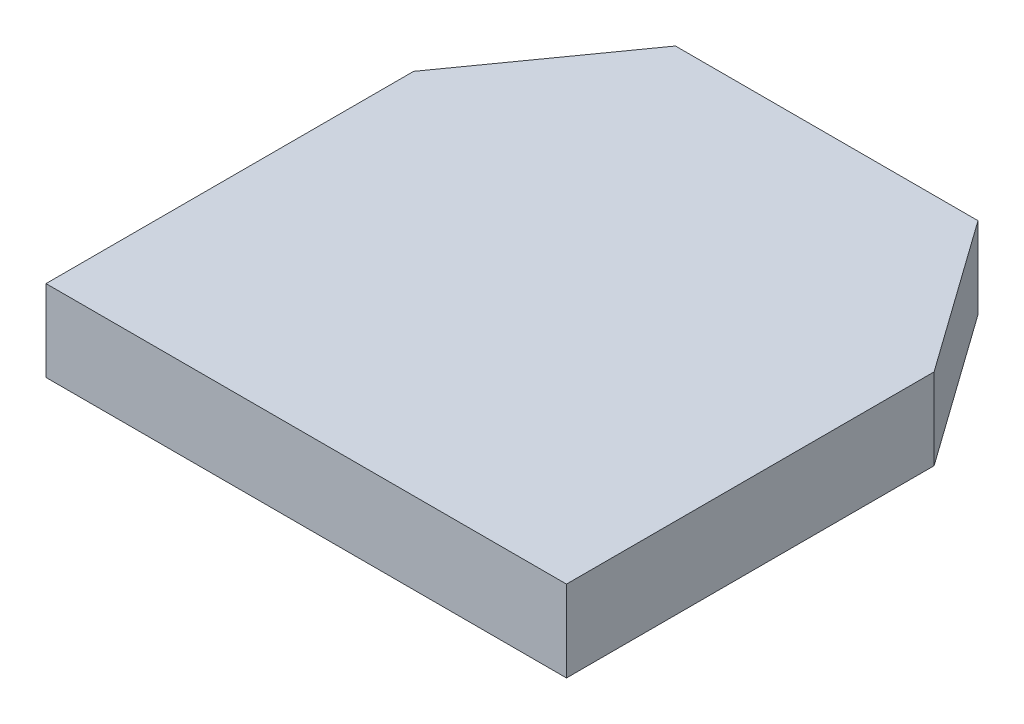
ISO-10303-21;
HEADER;
FILE_DESCRIPTION(('STEP AP214'),'2;1');
FILE_NAME('part.step','',(''),(''),'','','');
FILE_SCHEMA(('AUTOMOTIVE_DESIGN { 1 0 10303 214 1 1 1 1 }'));
ENDSEC;
DATA;
#1=APPLICATION_CONTEXT('core data for automotive mechanical design processes');
#2=APPLICATION_PROTOCOL_DEFINITION('international standard','automotive_design',2000,#1);
#3=PRODUCT_CONTEXT('',#1,'mechanical');
#4=PRODUCT('Part','Part','',(#3));
#5=PRODUCT_RELATED_PRODUCT_CATEGORY('part','',(#4));
#6=PRODUCT_DEFINITION_FORMATION('','',#4);
#7=PRODUCT_DEFINITION_CONTEXT('part definition',#1,'design');
#8=PRODUCT_DEFINITION('design','',#6,#7);
#9=PRODUCT_DEFINITION_SHAPE('','',#8);
#10=(LENGTH_UNIT() NAMED_UNIT(*) SI_UNIT(.MILLI.,.METRE.));
#11=(NAMED_UNIT(*) PLANE_ANGLE_UNIT() SI_UNIT($,.RADIAN.));
#12=(NAMED_UNIT(*) SI_UNIT($,.STERADIAN.) SOLID_ANGLE_UNIT());
#13=UNCERTAINTY_MEASURE_WITH_UNIT(LENGTH_MEASURE(1.E-05),#10,'distance_accuracy_value','');
#14=(GEOMETRIC_REPRESENTATION_CONTEXT(3) GLOBAL_UNCERTAINTY_ASSIGNED_CONTEXT((#13)) GLOBAL_UNIT_ASSIGNED_CONTEXT((#10,
#11,#12)) REPRESENTATION_CONTEXT('',''));
#15=CARTESIAN_POINT('',(0.,0.,0.));
#16=DIRECTION('',(0.,0.,1.));
#17=DIRECTION('',(1.,0.,0.));
#18=AXIS2_PLACEMENT_3D('',#15,#16,#17);
#19=CARTESIAN_POINT('',(0.,6.35,0.));
#20=DIRECTION('',(1.,0.,0.));
#21=DIRECTION('',(0.,0.,-1.));
#22=AXIS2_PLACEMENT_3D('',#19,#20,#21);
#23=PLANE('',#22);
#24=DIRECTION('',(0.,0.,1.));
#25=VECTOR('',#24,1.);
#26=CARTESIAN_POINT('',(0.,0.,0.));
#27=LINE('',#26,#25);
#28=CARTESIAN_POINT('',(0.,0.,-28.702));
#29=VERTEX_POINT('',#28);
#30=CARTESIAN_POINT('',(0.,0.,0.));
#31=VERTEX_POINT('',#30);
#32=EDGE_CURVE('E116',#29,#31,#27,.T.);
#33=ORIENTED_EDGE('',*,*,#32,.T.);
#34=DIRECTION('',(0.,-1.,0.));
#35=VECTOR('',#34,1.);
#36=CARTESIAN_POINT('',(0.,6.35,0.));
#37=LINE('',#36,#35);
#38=CARTESIAN_POINT('',(0.,6.35,0.));
#39=VERTEX_POINT('',#38);
#40=EDGE_CURVE('E11',#39,#31,#37,.T.);
#41=ORIENTED_EDGE('',*,*,#40,.F.);
#42=DIRECTION('',(0.,0.,1.));
#43=VECTOR('',#42,1.);
#44=CARTESIAN_POINT('',(0.,6.35,0.));
#45=LINE('',#44,#43);
#46=CARTESIAN_POINT('',(0.,6.35,-28.702));
#47=VERTEX_POINT('',#46);
#48=EDGE_CURVE('E126',#47,#39,#45,.T.);
#49=ORIENTED_EDGE('',*,*,#48,.F.);
#50=DIRECTION('',(0.,-1.,0.));
#51=VECTOR('',#50,1.);
#52=CARTESIAN_POINT('',(0.,6.35,-28.702));
#53=LINE('',#52,#51);
#54=EDGE_CURVE('E112',#47,#29,#53,.T.);
#55=ORIENTED_EDGE('',*,*,#54,.T.);
#56=EDGE_LOOP('',(#33,#41,#49,#55));
#57=FACE_BOUND('',#56,.T.);
#58=ADVANCED_FACE('F32',(#57),#23,.F.);
#59=CARTESIAN_POINT('',(0.,6.35,0.));
#60=DIRECTION('',(0.,0.,-1.));
#61=DIRECTION('',(-1.,0.,0.));
#62=AXIS2_PLACEMENT_3D('',#59,#60,#61);
#63=PLANE('',#62);
#64=DIRECTION('',(1.,0.,0.));
#65=VECTOR('',#64,1.);
#66=CARTESIAN_POINT('',(0.,0.,0.));
#67=LINE('',#66,#65);
#68=CARTESIAN_POINT('',(40.64,0.,0.));
#69=VERTEX_POINT('',#68);
#70=EDGE_CURVE('E119',#31,#69,#67,.T.);
#71=ORIENTED_EDGE('',*,*,#70,.T.);
#72=DIRECTION('',(0.,-1.,0.));
#73=VECTOR('',#72,1.);
#74=CARTESIAN_POINT('',(40.64,6.35,0.));
#75=LINE('',#74,#73);
#76=CARTESIAN_POINT('',(40.64,6.35,0.));
#77=VERTEX_POINT('',#76);
#78=EDGE_CURVE('E40',#77,#69,#75,.T.);
#79=ORIENTED_EDGE('',*,*,#78,.F.);
#80=DIRECTION('',(1.,0.,0.));
#81=VECTOR('',#80,1.);
#82=CARTESIAN_POINT('',(0.,6.35,0.));
#83=LINE('',#82,#81);
#84=EDGE_CURVE('E85',#39,#77,#83,.T.);
#85=ORIENTED_EDGE('',*,*,#84,.F.);
#86=ORIENTED_EDGE('',*,*,#40,.T.);
#87=EDGE_LOOP('',(#71,#79,#85,#86));
#88=FACE_BOUND('',#87,.T.);
#89=ADVANCED_FACE('F150',(#88),#63,.F.);
#90=CARTESIAN_POINT('',(40.64,6.35,0.));
#91=DIRECTION('',(-1.,0.,0.));
#92=DIRECTION('',(0.,0.,1.));
#93=AXIS2_PLACEMENT_3D('',#90,#91,#92);
#94=PLANE('',#93);
#95=DIRECTION('',(0.,0.,-1.));
#96=VECTOR('',#95,1.);
#97=CARTESIAN_POINT('',(40.64,0.,0.));
#98=LINE('',#97,#96);
#99=CARTESIAN_POINT('',(40.64,0.,-28.702));
#100=VERTEX_POINT('',#99);
#101=EDGE_CURVE('E121',#69,#100,#98,.T.);
#102=ORIENTED_EDGE('',*,*,#101,.T.);
#103=DIRECTION('',(0.,-1.,0.));
#104=VECTOR('',#103,1.);
#105=CARTESIAN_POINT('',(40.64,6.35,-28.702));
#106=LINE('',#105,#104);
#107=CARTESIAN_POINT('',(40.64,6.35,-28.702));
#108=VERTEX_POINT('',#107);
#109=EDGE_CURVE('E107',#108,#100,#106,.T.);
#110=ORIENTED_EDGE('',*,*,#109,.F.);
#111=DIRECTION('',(0.,0.,-1.));
#112=VECTOR('',#111,1.);
#113=CARTESIAN_POINT('',(40.64,6.35,0.));
#114=LINE('',#113,#112);
#115=EDGE_CURVE('E98',#77,#108,#114,.T.);
#116=ORIENTED_EDGE('',*,*,#115,.F.);
#117=ORIENTED_EDGE('',*,*,#78,.T.);
#118=EDGE_LOOP('',(#102,#110,#116,#117));
#119=FACE_BOUND('',#118,.T.);
#120=ADVANCED_FACE('F132',(#119),#94,.F.);
#121=CARTESIAN_POINT('',(40.64,6.35,-28.702));
#122=DIRECTION('',(-0.814318393829515,0.,0.580418429644442));
#123=DIRECTION('',(0.580418429644442,0.,0.814318393829515));
#124=AXIS2_PLACEMENT_3D('',#121,#122,#123);
#125=PLANE('',#124);
#126=DIRECTION('',(-0.580418429644442,0.,-0.814318393829515));
#127=VECTOR('',#126,1.);
#128=CARTESIAN_POINT('',(40.64,0.,-28.702));
#129=LINE('',#128,#127);
#130=CARTESIAN_POINT('',(32.131,0.,-40.64));
#131=VERTEX_POINT('',#130);
#132=EDGE_CURVE('E106',#100,#131,#129,.T.);
#133=ORIENTED_EDGE('',*,*,#132,.T.);
#134=DIRECTION('',(0.,-1.,0.));
#135=VECTOR('',#134,1.);
#136=CARTESIAN_POINT('',(32.131,6.35,-40.64));
#137=LINE('',#136,#135);
#138=CARTESIAN_POINT('',(32.131,6.35,-40.64));
#139=VERTEX_POINT('',#138);
#140=EDGE_CURVE('E103',#139,#131,#137,.T.);
#141=ORIENTED_EDGE('',*,*,#140,.F.);
#142=DIRECTION('',(-0.580418429644442,0.,-0.814318393829515));
#143=VECTOR('',#142,1.);
#144=CARTESIAN_POINT('',(40.64,6.35,-28.702));
#145=LINE('',#144,#143);
#146=EDGE_CURVE('E92',#108,#139,#145,.T.);
#147=ORIENTED_EDGE('',*,*,#146,.F.);
#148=ORIENTED_EDGE('',*,*,#109,.T.);
#149=EDGE_LOOP('',(#133,#141,#147,#148));
#150=FACE_BOUND('',#149,.T.);
#151=ADVANCED_FACE('F104',(#150),#125,.F.);
#152=CARTESIAN_POINT('',(8.509,6.35,-40.64));
#153=DIRECTION('',(0.,0.,1.));
#154=DIRECTION('',(1.,0.,0.));
#155=AXIS2_PLACEMENT_3D('',#152,#153,#154);
#156=PLANE('',#155);
#157=DIRECTION('',(-1.,0.,0.));
#158=VECTOR('',#157,1.);
#159=CARTESIAN_POINT('',(8.509,0.,-40.64));
#160=LINE('',#159,#158);
#161=CARTESIAN_POINT('',(8.509,0.,-40.64));
#162=VERTEX_POINT('',#161);
#163=EDGE_CURVE('E71',#131,#162,#160,.T.);
#164=ORIENTED_EDGE('',*,*,#163,.T.);
#165=DIRECTION('',(0.,-1.,0.));
#166=VECTOR('',#165,1.);
#167=CARTESIAN_POINT('',(8.509,6.35,-40.64));
#168=LINE('',#167,#166);
#169=CARTESIAN_POINT('',(8.509,6.35,-40.64));
#170=VERTEX_POINT('',#169);
#171=EDGE_CURVE('E108',#170,#162,#168,.T.);
#172=ORIENTED_EDGE('',*,*,#171,.F.);
#173=DIRECTION('',(-1.,0.,0.));
#174=VECTOR('',#173,1.);
#175=CARTESIAN_POINT('',(8.509,6.35,-40.64));
#176=LINE('',#175,#174);
#177=EDGE_CURVE('E96',#139,#170,#176,.T.);
#178=ORIENTED_EDGE('',*,*,#177,.F.);
#179=ORIENTED_EDGE('',*,*,#140,.T.);
#180=EDGE_LOOP('',(#164,#172,#178,#179));
#181=FACE_BOUND('',#180,.T.);
#182=ADVANCED_FACE('F110',(#181),#156,.F.);
#183=CARTESIAN_POINT('',(0.,6.35,-28.702));
#184=DIRECTION('',(0.814318393829515,0.,0.580418429644441));
#185=DIRECTION('',(0.580418429644442,0.,-0.814318393829515));
#186=AXIS2_PLACEMENT_3D('',#183,#184,#185);
#187=PLANE('',#186);
#188=DIRECTION('',(-0.580418429644442,0.,0.814318393829515));
#189=VECTOR('',#188,1.);
#190=CARTESIAN_POINT('',(0.,0.,-28.702));
#191=LINE('',#190,#189);
#192=EDGE_CURVE('E77',#162,#29,#191,.T.);
#193=ORIENTED_EDGE('',*,*,#192,.T.);
#194=ORIENTED_EDGE('',*,*,#54,.F.);
#195=DIRECTION('',(-0.580418429644442,0.,0.814318393829515));
#196=VECTOR('',#195,1.);
#197=CARTESIAN_POINT('',(0.,6.35,-28.702));
#198=LINE('',#197,#196);
#199=EDGE_CURVE('E48',#170,#47,#198,.T.);
#200=ORIENTED_EDGE('',*,*,#199,.F.);
#201=ORIENTED_EDGE('',*,*,#171,.T.);
#202=EDGE_LOOP('',(#193,#194,#200,#201));
#203=FACE_BOUND('',#202,.T.);
#204=ADVANCED_FACE('F139',(#203),#187,.F.);
#205=CARTESIAN_POINT('',(0.,6.35,0.));
#206=DIRECTION('',(0.,-1.,0.));
#207=DIRECTION('',(0.,0.,-1.));
#208=AXIS2_PLACEMENT_3D('',#205,#206,#207);
#209=PLANE('',#208);
#210=ORIENTED_EDGE('',*,*,#48,.T.);
#211=ORIENTED_EDGE('',*,*,#84,.T.);
#212=ORIENTED_EDGE('',*,*,#115,.T.);
#213=ORIENTED_EDGE('',*,*,#146,.T.);
#214=ORIENTED_EDGE('',*,*,#177,.T.);
#215=ORIENTED_EDGE('',*,*,#199,.T.);
#216=EDGE_LOOP('',(#210,#211,#212,#213,#214,#215));
#217=FACE_BOUND('',#216,.T.);
#218=ADVANCED_FACE('F94',(#217),#209,.F.);
#219=CARTESIAN_POINT('',(0.,0.,0.));
#220=DIRECTION('',(0.,-1.,0.));
#221=DIRECTION('',(0.,0.,-1.));
#222=AXIS2_PLACEMENT_3D('',#219,#220,#221);
#223=PLANE('',#222);
#224=ORIENTED_EDGE('',*,*,#32,.F.);
#225=ORIENTED_EDGE('',*,*,#192,.F.);
#226=ORIENTED_EDGE('',*,*,#163,.F.);
#227=ORIENTED_EDGE('',*,*,#132,.F.);
#228=ORIENTED_EDGE('',*,*,#101,.F.);
#229=ORIENTED_EDGE('',*,*,#70,.F.);
#230=EDGE_LOOP('',(#224,#225,#226,#227,#228,#229));
#231=FACE_BOUND('',#230,.T.);
#232=ADVANCED_FACE('F135',(#231),#223,.T.);
#233=CLOSED_SHELL('',(#58,#89,#120,#151,#182,#204,#218,#232));
#234=MANIFOLD_SOLID_BREP('B2',#233);
#235=ADVANCED_BREP_SHAPE_REPRESENTATION('',(#18,#234),#14);
#236=SHAPE_DEFINITION_REPRESENTATION(#9,#235);
ENDSEC;
END-ISO-10303-21;
